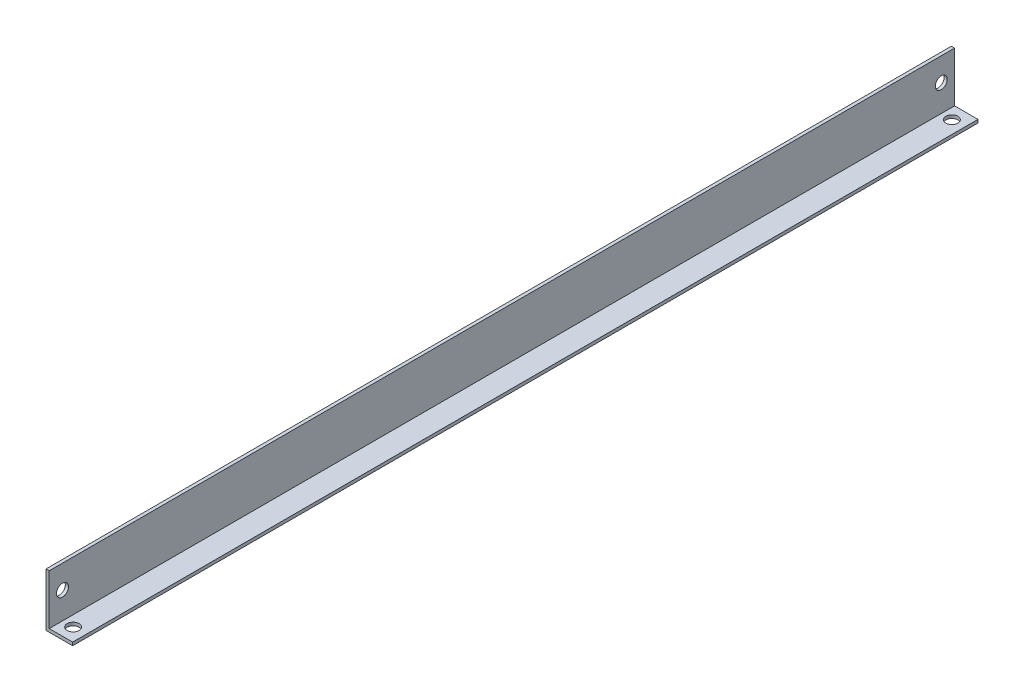
ISO-10303-21;
HEADER;
FILE_DESCRIPTION(('STEP AP214'),'2;1');
FILE_NAME('part.step','',(''),(''),'','','');
FILE_SCHEMA(('AUTOMOTIVE_DESIGN { 1 0 10303 214 1 1 1 1 }'));
ENDSEC;
DATA;
#1=APPLICATION_CONTEXT('core data for automotive mechanical design processes');
#2=APPLICATION_PROTOCOL_DEFINITION('international standard','automotive_design',2000,#1);
#3=PRODUCT_CONTEXT('',#1,'mechanical');
#4=PRODUCT('Part','Part','',(#3));
#5=PRODUCT_RELATED_PRODUCT_CATEGORY('part','',(#4));
#6=PRODUCT_DEFINITION_FORMATION('','',#4);
#7=PRODUCT_DEFINITION_CONTEXT('part definition',#1,'design');
#8=PRODUCT_DEFINITION('design','',#6,#7);
#9=PRODUCT_DEFINITION_SHAPE('','',#8);
#10=(LENGTH_UNIT() NAMED_UNIT(*) SI_UNIT(.MILLI.,.METRE.));
#11=(NAMED_UNIT(*) PLANE_ANGLE_UNIT() SI_UNIT($,.RADIAN.));
#12=(NAMED_UNIT(*) SI_UNIT($,.STERADIAN.) SOLID_ANGLE_UNIT());
#13=UNCERTAINTY_MEASURE_WITH_UNIT(LENGTH_MEASURE(1.E-05),#10,'distance_accuracy_value','');
#14=(GEOMETRIC_REPRESENTATION_CONTEXT(3) GLOBAL_UNCERTAINTY_ASSIGNED_CONTEXT((#13)) GLOBAL_UNIT_ASSIGNED_CONTEXT((#10,
#11,#12)) REPRESENTATION_CONTEXT('',''));
#15=CARTESIAN_POINT('',(0.,0.,0.));
#16=DIRECTION('',(0.,0.,1.));
#17=DIRECTION('',(1.,0.,0.));
#18=AXIS2_PLACEMENT_3D('',#15,#16,#17);
#19=CARTESIAN_POINT('',(10.,0.,340.));
#20=DIRECTION('',(0.,1.,0.));
#21=DIRECTION('',(-1.,0.,0.));
#22=AXIS2_PLACEMENT_3D('',#19,#20,#21);
#23=PLANE('',#22);
#24=CARTESIAN_POINT('',(5.2,0.,5.));
#25=DIRECTION('',(0.,-1.,0.));
#26=DIRECTION('',(0.,0.,-1.));
#27=AXIS2_PLACEMENT_3D('',#24,#25,#26);
#28=CIRCLE('',#27,2.24999999999999);
#29=CARTESIAN_POINT('',(5.2,0.,2.75000000000001));
#30=VERTEX_POINT('',#29);
#31=EDGE_CURVE('E150',#30,#30,#28,.T.);
#32=ORIENTED_EDGE('',*,*,#31,.F.);
#33=EDGE_LOOP('',(#32));
#34=FACE_BOUND('',#33,.T.);
#35=CARTESIAN_POINT('',(5.2,0.,335.));
#36=DIRECTION('',(0.,-1.,0.));
#37=DIRECTION('',(0.,0.,-1.));
#38=AXIS2_PLACEMENT_3D('',#35,#36,#37);
#39=CIRCLE('',#38,2.24999999999999);
#40=CARTESIAN_POINT('',(5.2,0.,332.75));
#41=VERTEX_POINT('',#40);
#42=EDGE_CURVE('E139',#41,#41,#39,.T.);
#43=ORIENTED_EDGE('',*,*,#42,.F.);
#44=EDGE_LOOP('',(#43));
#45=FACE_BOUND('',#44,.T.);
#46=DIRECTION('',(1.,0.,0.));
#47=VECTOR('',#46,1.);
#48=CARTESIAN_POINT('',(10.,0.,0.));
#49=LINE('',#48,#47);
#50=CARTESIAN_POINT('',(0.,0.,0.));
#51=VERTEX_POINT('',#50);
#52=CARTESIAN_POINT('',(10.,0.,0.));
#53=VERTEX_POINT('',#52);
#54=EDGE_CURVE('E120',#51,#53,#49,.T.);
#55=ORIENTED_EDGE('',*,*,#54,.T.);
#56=DIRECTION('',(0.,0.,-1.));
#57=VECTOR('',#56,1.);
#58=CARTESIAN_POINT('',(10.,0.,340.));
#59=LINE('',#58,#57);
#60=CARTESIAN_POINT('',(10.,0.,340.));
#61=VERTEX_POINT('',#60);
#62=EDGE_CURVE('E11',#61,#53,#59,.T.);
#63=ORIENTED_EDGE('',*,*,#62,.F.);
#64=DIRECTION('',(1.,0.,0.));
#65=VECTOR('',#64,1.);
#66=CARTESIAN_POINT('',(10.,0.,340.));
#67=LINE('',#66,#65);
#68=CARTESIAN_POINT('',(0.,0.,340.));
#69=VERTEX_POINT('',#68);
#70=EDGE_CURVE('E131',#69,#61,#67,.T.);
#71=ORIENTED_EDGE('',*,*,#70,.F.);
#72=DIRECTION('',(0.,0.,-1.));
#73=VECTOR('',#72,1.);
#74=CARTESIAN_POINT('',(0.,0.,340.));
#75=LINE('',#74,#73);
#76=EDGE_CURVE('E116',#69,#51,#75,.T.);
#77=ORIENTED_EDGE('',*,*,#76,.T.);
#78=EDGE_LOOP('',(#55,#63,#71,#77));
#79=FACE_BOUND('',#78,.T.);
#80=ADVANCED_FACE('F34',(#34,#45,#79),#23,.F.);
#81=CARTESIAN_POINT('',(10.,1.2,340.));
#82=DIRECTION('',(-1.,0.,0.));
#83=DIRECTION('',(0.,0.,1.));
#84=AXIS2_PLACEMENT_3D('',#81,#82,#83);
#85=PLANE('',#84);
#86=DIRECTION('',(0.,1.,0.));
#87=VECTOR('',#86,1.);
#88=CARTESIAN_POINT('',(10.,1.2,0.));
#89=LINE('',#88,#87);
#90=CARTESIAN_POINT('',(10.,1.2,0.));
#91=VERTEX_POINT('',#90);
#92=EDGE_CURVE('E123',#53,#91,#89,.T.);
#93=ORIENTED_EDGE('',*,*,#92,.T.);
#94=DIRECTION('',(0.,0.,-1.));
#95=VECTOR('',#94,1.);
#96=CARTESIAN_POINT('',(10.,1.2,340.));
#97=LINE('',#96,#95);
#98=CARTESIAN_POINT('',(10.,1.2,340.));
#99=VERTEX_POINT('',#98);
#100=EDGE_CURVE('E43',#99,#91,#97,.T.);
#101=ORIENTED_EDGE('',*,*,#100,.F.);
#102=DIRECTION('',(0.,1.,0.));
#103=VECTOR('',#102,1.);
#104=CARTESIAN_POINT('',(10.,1.2,340.));
#105=LINE('',#104,#103);
#106=EDGE_CURVE('E89',#61,#99,#105,.T.);
#107=ORIENTED_EDGE('',*,*,#106,.F.);
#108=ORIENTED_EDGE('',*,*,#62,.T.);
#109=EDGE_LOOP('',(#93,#101,#107,#108));
#110=FACE_BOUND('',#109,.T.);
#111=ADVANCED_FACE('F163',(#110),#85,.F.);
#112=CARTESIAN_POINT('',(1.2,1.2,340.));
#113=DIRECTION('',(0.,-1.,0.));
#114=DIRECTION('',(1.,0.,0.));
#115=AXIS2_PLACEMENT_3D('',#112,#113,#114);
#116=PLANE('',#115);
#117=CARTESIAN_POINT('',(5.2,1.2,5.));
#118=DIRECTION('',(0.,-1.,0.));
#119=DIRECTION('',(1.,0.,0.));
#120=AXIS2_PLACEMENT_3D('',#117,#118,#119);
#121=CIRCLE('',#120,2.24999999999999);
#122=CARTESIAN_POINT('',(7.44999999999999,1.2,5.));
#123=VERTEX_POINT('',#122);
#124=EDGE_CURVE('E37',#123,#123,#121,.T.);
#125=ORIENTED_EDGE('',*,*,#124,.T.);
#126=EDGE_LOOP('',(#125));
#127=FACE_BOUND('',#126,.T.);
#128=CARTESIAN_POINT('',(5.2,1.2,335.));
#129=DIRECTION('',(0.,-1.,0.));
#130=DIRECTION('',(1.,0.,0.));
#131=AXIS2_PLACEMENT_3D('',#128,#129,#130);
#132=CIRCLE('',#131,2.24999999999999);
#133=CARTESIAN_POINT('',(7.44999999999999,1.2,335.));
#134=VERTEX_POINT('',#133);
#135=EDGE_CURVE('E136',#134,#134,#132,.T.);
#136=ORIENTED_EDGE('',*,*,#135,.T.);
#137=EDGE_LOOP('',(#136));
#138=FACE_BOUND('',#137,.T.);
#139=DIRECTION('',(-1.,0.,0.));
#140=VECTOR('',#139,1.);
#141=CARTESIAN_POINT('',(1.2,1.2,0.));
#142=LINE('',#141,#140);
#143=CARTESIAN_POINT('',(1.2,1.2,0.));
#144=VERTEX_POINT('',#143);
#145=EDGE_CURVE('E126',#91,#144,#142,.T.);
#146=ORIENTED_EDGE('',*,*,#145,.T.);
#147=DIRECTION('',(0.,0.,-1.));
#148=VECTOR('',#147,1.);
#149=CARTESIAN_POINT('',(1.2,1.2,340.));
#150=LINE('',#149,#148);
#151=CARTESIAN_POINT('',(1.2,1.2,340.));
#152=VERTEX_POINT('',#151);
#153=EDGE_CURVE('E111',#152,#144,#150,.T.);
#154=ORIENTED_EDGE('',*,*,#153,.F.);
#155=DIRECTION('',(-1.,0.,0.));
#156=VECTOR('',#155,1.);
#157=CARTESIAN_POINT('',(1.2,1.2,340.));
#158=LINE('',#157,#156);
#159=EDGE_CURVE('E102',#99,#152,#158,.T.);
#160=ORIENTED_EDGE('',*,*,#159,.F.);
#161=ORIENTED_EDGE('',*,*,#100,.T.);
#162=EDGE_LOOP('',(#146,#154,#160,#161));
#163=FACE_BOUND('',#162,.T.);
#164=ADVANCED_FACE('F166',(#127,#138,#163),#116,.F.);
#165=CARTESIAN_POINT('',(1.2,20.,340.));
#166=DIRECTION('',(-1.,0.,0.));
#167=DIRECTION('',(0.,-1.,0.));
#168=AXIS2_PLACEMENT_3D('',#165,#166,#167);
#169=PLANE('',#168);
#170=CARTESIAN_POINT('',(1.2,11.2,335.));
#171=DIRECTION('',(-1.,0.,0.));
#172=DIRECTION('',(0.,-1.,0.));
#173=AXIS2_PLACEMENT_3D('',#170,#171,#172);
#174=CIRCLE('',#173,2.24999999999999);
#175=CARTESIAN_POINT('',(1.2,8.95000000000001,335.));
#176=VERTEX_POINT('',#175);
#177=EDGE_CURVE('E143',#176,#176,#174,.T.);
#178=ORIENTED_EDGE('',*,*,#177,.T.);
#179=EDGE_LOOP('',(#178));
#180=FACE_BOUND('',#179,.T.);
#181=CARTESIAN_POINT('',(1.2,11.2,5.));
#182=DIRECTION('',(-1.,0.,0.));
#183=DIRECTION('',(0.,-1.,0.));
#184=AXIS2_PLACEMENT_3D('',#181,#182,#183);
#185=CIRCLE('',#184,2.24999999999999);
#186=CARTESIAN_POINT('',(1.2,8.95000000000001,5.));
#187=VERTEX_POINT('',#186);
#188=EDGE_CURVE('E124',#187,#187,#185,.T.);
#189=ORIENTED_EDGE('',*,*,#188,.T.);
#190=EDGE_LOOP('',(#189));
#191=FACE_BOUND('',#190,.T.);
#192=DIRECTION('',(0.,1.,0.));
#193=VECTOR('',#192,1.);
#194=CARTESIAN_POINT('',(1.2,20.,0.));
#195=LINE('',#194,#193);
#196=CARTESIAN_POINT('',(1.2,20.,0.));
#197=VERTEX_POINT('',#196);
#198=EDGE_CURVE('E110',#144,#197,#195,.T.);
#199=ORIENTED_EDGE('',*,*,#198,.T.);
#200=DIRECTION('',(0.,0.,-1.));
#201=VECTOR('',#200,1.);
#202=CARTESIAN_POINT('',(1.2,20.,340.));
#203=LINE('',#202,#201);
#204=CARTESIAN_POINT('',(1.2,20.,340.));
#205=VERTEX_POINT('',#204);
#206=EDGE_CURVE('E107',#205,#197,#203,.T.);
#207=ORIENTED_EDGE('',*,*,#206,.F.);
#208=DIRECTION('',(0.,1.,0.));
#209=VECTOR('',#208,1.);
#210=CARTESIAN_POINT('',(1.2,20.,340.));
#211=LINE('',#210,#209);
#212=EDGE_CURVE('E96',#152,#205,#211,.T.);
#213=ORIENTED_EDGE('',*,*,#212,.F.);
#214=ORIENTED_EDGE('',*,*,#153,.T.);
#215=EDGE_LOOP('',(#199,#207,#213,#214));
#216=FACE_BOUND('',#215,.T.);
#217=ADVANCED_FACE('F108',(#180,#191,#216),#169,.F.);
#218=CARTESIAN_POINT('',(0.,20.,340.));
#219=DIRECTION('',(0.,-1.,0.));
#220=DIRECTION('',(0.,0.,-1.));
#221=AXIS2_PLACEMENT_3D('',#218,#219,#220);
#222=PLANE('',#221);
#223=DIRECTION('',(-1.,0.,0.));
#224=VECTOR('',#223,1.);
#225=CARTESIAN_POINT('',(0.,20.,0.));
#226=LINE('',#225,#224);
#227=CARTESIAN_POINT('',(0.,20.,0.));
#228=VERTEX_POINT('',#227);
#229=EDGE_CURVE('E75',#197,#228,#226,.T.);
#230=ORIENTED_EDGE('',*,*,#229,.T.);
#231=DIRECTION('',(0.,0.,-1.));
#232=VECTOR('',#231,1.);
#233=CARTESIAN_POINT('',(0.,20.,340.));
#234=LINE('',#233,#232);
#235=CARTESIAN_POINT('',(0.,20.,340.));
#236=VERTEX_POINT('',#235);
#237=EDGE_CURVE('E112',#236,#228,#234,.T.);
#238=ORIENTED_EDGE('',*,*,#237,.F.);
#239=DIRECTION('',(-1.,0.,0.));
#240=VECTOR('',#239,1.);
#241=CARTESIAN_POINT('',(0.,20.,340.));
#242=LINE('',#241,#240);
#243=EDGE_CURVE('E100',#205,#236,#242,.T.);
#244=ORIENTED_EDGE('',*,*,#243,.F.);
#245=ORIENTED_EDGE('',*,*,#206,.T.);
#246=EDGE_LOOP('',(#230,#238,#244,#245));
#247=FACE_BOUND('',#246,.T.);
#248=ADVANCED_FACE('F114',(#247),#222,.F.);
#249=CARTESIAN_POINT('',(0.,0.,340.));
#250=DIRECTION('',(1.,0.,0.));
#251=DIRECTION('',(0.,0.,-1.));
#252=AXIS2_PLACEMENT_3D('',#249,#250,#251);
#253=PLANE('',#252);
#254=CARTESIAN_POINT('',(0.,11.2,335.));
#255=DIRECTION('',(-1.,0.,0.));
#256=DIRECTION('',(0.,0.,1.));
#257=AXIS2_PLACEMENT_3D('',#254,#255,#256);
#258=CIRCLE('',#257,2.24999999999999);
#259=CARTESIAN_POINT('',(0.,11.2,337.25));
#260=VERTEX_POINT('',#259);
#261=EDGE_CURVE('E138',#260,#260,#258,.T.);
#262=ORIENTED_EDGE('',*,*,#261,.F.);
#263=EDGE_LOOP('',(#262));
#264=FACE_BOUND('',#263,.T.);
#265=CARTESIAN_POINT('',(0.,11.2,5.));
#266=DIRECTION('',(-1.,0.,0.));
#267=DIRECTION('',(0.,0.,1.));
#268=AXIS2_PLACEMENT_3D('',#265,#266,#267);
#269=CIRCLE('',#268,2.24999999999999);
#270=CARTESIAN_POINT('',(0.,11.2,7.24999999999999));
#271=VERTEX_POINT('',#270);
#272=EDGE_CURVE('E155',#271,#271,#269,.T.);
#273=ORIENTED_EDGE('',*,*,#272,.F.);
#274=EDGE_LOOP('',(#273));
#275=FACE_BOUND('',#274,.T.);
#276=DIRECTION('',(0.,-1.,0.));
#277=VECTOR('',#276,1.);
#278=CARTESIAN_POINT('',(0.,0.,0.));
#279=LINE('',#278,#277);
#280=EDGE_CURVE('E81',#228,#51,#279,.T.);
#281=ORIENTED_EDGE('',*,*,#280,.T.);
#282=ORIENTED_EDGE('',*,*,#76,.F.);
#283=DIRECTION('',(0.,-1.,0.));
#284=VECTOR('',#283,1.);
#285=CARTESIAN_POINT('',(0.,0.,340.));
#286=LINE('',#285,#284);
#287=EDGE_CURVE('E52',#236,#69,#286,.T.);
#288=ORIENTED_EDGE('',*,*,#287,.F.);
#289=ORIENTED_EDGE('',*,*,#237,.T.);
#290=EDGE_LOOP('',(#281,#282,#288,#289));
#291=FACE_BOUND('',#290,.T.);
#292=ADVANCED_FACE('F171',(#264,#275,#291),#253,.F.);
#293=CARTESIAN_POINT('',(0.,0.,340.));
#294=DIRECTION('',(0.,0.,-1.));
#295=DIRECTION('',(-1.,0.,0.));
#296=AXIS2_PLACEMENT_3D('',#293,#294,#295);
#297=PLANE('',#296);
#298=ORIENTED_EDGE('',*,*,#70,.T.);
#299=ORIENTED_EDGE('',*,*,#106,.T.);
#300=ORIENTED_EDGE('',*,*,#159,.T.);
#301=ORIENTED_EDGE('',*,*,#212,.T.);
#302=ORIENTED_EDGE('',*,*,#243,.T.);
#303=ORIENTED_EDGE('',*,*,#287,.T.);
#304=EDGE_LOOP('',(#298,#299,#300,#301,#302,#303));
#305=FACE_BOUND('',#304,.T.);
#306=ADVANCED_FACE('F98',(#305),#297,.F.);
#307=CARTESIAN_POINT('',(0.,0.,0.));
#308=DIRECTION('',(0.,0.,-1.));
#309=DIRECTION('',(-1.,0.,0.));
#310=AXIS2_PLACEMENT_3D('',#307,#308,#309);
#311=PLANE('',#310);
#312=ORIENTED_EDGE('',*,*,#54,.F.);
#313=ORIENTED_EDGE('',*,*,#280,.F.);
#314=ORIENTED_EDGE('',*,*,#229,.F.);
#315=ORIENTED_EDGE('',*,*,#198,.F.);
#316=ORIENTED_EDGE('',*,*,#145,.F.);
#317=ORIENTED_EDGE('',*,*,#92,.F.);
#318=EDGE_LOOP('',(#312,#313,#314,#315,#316,#317));
#319=FACE_BOUND('',#318,.T.);
#320=ADVANCED_FACE('F169',(#319),#311,.T.);
#321=CARTESIAN_POINT('',(0.,11.2,5.));
#322=DIRECTION('',(-1.,0.,0.));
#323=DIRECTION('',(0.,0.,1.));
#324=AXIS2_PLACEMENT_3D('',#321,#322,#323);
#325=CYLINDRICAL_SURFACE('',#324,2.24999999999999);
#326=ORIENTED_EDGE('',*,*,#272,.T.);
#327=EDGE_LOOP('',(#326));
#328=FACE_BOUND('',#327,.T.);
#329=ORIENTED_EDGE('',*,*,#188,.F.);
#330=EDGE_LOOP('',(#329));
#331=FACE_BOUND('',#330,.T.);
#332=ADVANCED_FACE('F213',(#328,#331),#325,.F.);
#333=CARTESIAN_POINT('',(0.,11.2,335.));
#334=DIRECTION('',(-1.,0.,0.));
#335=DIRECTION('',(0.,0.,1.));
#336=AXIS2_PLACEMENT_3D('',#333,#334,#335);
#337=CYLINDRICAL_SURFACE('',#336,2.24999999999999);
#338=ORIENTED_EDGE('',*,*,#261,.T.);
#339=EDGE_LOOP('',(#338));
#340=FACE_BOUND('',#339,.T.);
#341=ORIENTED_EDGE('',*,*,#177,.F.);
#342=EDGE_LOOP('',(#341));
#343=FACE_BOUND('',#342,.T.);
#344=ADVANCED_FACE('F215',(#340,#343),#337,.F.);
#345=CARTESIAN_POINT('',(5.2,0.,335.));
#346=DIRECTION('',(0.,-1.,0.));
#347=DIRECTION('',(0.,0.,-1.));
#348=AXIS2_PLACEMENT_3D('',#345,#346,#347);
#349=CYLINDRICAL_SURFACE('',#348,2.24999999999999);
#350=ORIENTED_EDGE('',*,*,#42,.T.);
#351=EDGE_LOOP('',(#350));
#352=FACE_BOUND('',#351,.T.);
#353=ORIENTED_EDGE('',*,*,#135,.F.);
#354=EDGE_LOOP('',(#353));
#355=FACE_BOUND('',#354,.T.);
#356=ADVANCED_FACE('F196',(#352,#355),#349,.F.);
#357=CARTESIAN_POINT('',(5.2,0.,5.));
#358=DIRECTION('',(0.,-1.,0.));
#359=DIRECTION('',(0.,0.,-1.));
#360=AXIS2_PLACEMENT_3D('',#357,#358,#359);
#361=CYLINDRICAL_SURFACE('',#360,2.24999999999999);
#362=ORIENTED_EDGE('',*,*,#31,.T.);
#363=EDGE_LOOP('',(#362));
#364=FACE_BOUND('',#363,.T.);
#365=ORIENTED_EDGE('',*,*,#124,.F.);
#366=EDGE_LOOP('',(#365));
#367=FACE_BOUND('',#366,.T.);
#368=ADVANCED_FACE('F193',(#364,#367),#361,.F.);
#369=CLOSED_SHELL('',(#80,#111,#164,#217,#248,#292,#306,#320,#332,#344,#356,#368));
#370=MANIFOLD_SOLID_BREP('B2',#369);
#371=ADVANCED_BREP_SHAPE_REPRESENTATION('',(#18,#370),#14);
#372=SHAPE_DEFINITION_REPRESENTATION(#9,#371);
ENDSEC;
END-ISO-10303-21;
